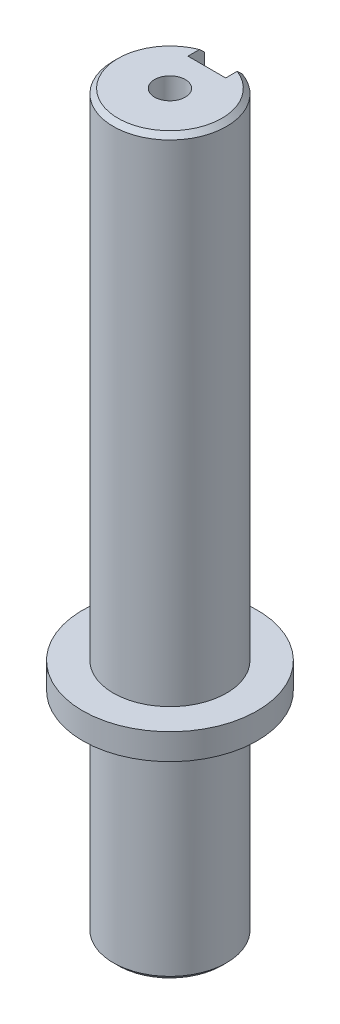
ISO-10303-21;
HEADER;
FILE_DESCRIPTION(('STEP AP214'),'2;1');
FILE_NAME('part.step','',(''),(''),'','','');
FILE_SCHEMA(('AUTOMOTIVE_DESIGN { 1 0 10303 214 1 1 1 1 }'));
ENDSEC;
DATA;
#1=APPLICATION_CONTEXT('core data for automotive mechanical design processes');
#2=APPLICATION_PROTOCOL_DEFINITION('international standard','automotive_design',2000,#1);
#3=PRODUCT_CONTEXT('',#1,'mechanical');
#4=PRODUCT('Part','Part','',(#3));
#5=PRODUCT_RELATED_PRODUCT_CATEGORY('part','',(#4));
#6=PRODUCT_DEFINITION_FORMATION('','',#4);
#7=PRODUCT_DEFINITION_CONTEXT('part definition',#1,'design');
#8=PRODUCT_DEFINITION('design','',#6,#7);
#9=PRODUCT_DEFINITION_SHAPE('','',#8);
#10=(LENGTH_UNIT() NAMED_UNIT(*) SI_UNIT(.MILLI.,.METRE.));
#11=(NAMED_UNIT(*) PLANE_ANGLE_UNIT() SI_UNIT($,.RADIAN.));
#12=(NAMED_UNIT(*) SI_UNIT($,.STERADIAN.) SOLID_ANGLE_UNIT());
#13=UNCERTAINTY_MEASURE_WITH_UNIT(LENGTH_MEASURE(1.E-05),#10,'distance_accuracy_value','');
#14=(GEOMETRIC_REPRESENTATION_CONTEXT(3) GLOBAL_UNCERTAINTY_ASSIGNED_CONTEXT((#13)) GLOBAL_UNIT_ASSIGNED_CONTEXT((#10,
#11,#12)) REPRESENTATION_CONTEXT('',''));
#15=CARTESIAN_POINT('',(0.,0.,0.));
#16=DIRECTION('',(0.,0.,1.));
#17=DIRECTION('',(1.,0.,0.));
#18=AXIS2_PLACEMENT_3D('',#15,#16,#17);
#19=CARTESIAN_POINT('',(0.,53.5,-7.81370849898466));
#20=DIRECTION('',(0.,0.,-1.));
#21=DIRECTION('',(-1.,0.,0.));
#22=AXIS2_PLACEMENT_3D('',#19,#20,#21);
#23=PLANE('',#22);
#24=DIRECTION('',(0.,1.,0.));
#25=VECTOR('',#24,1.);
#26=CARTESIAN_POINT('',(4.,53.5,-7.81370849898466));
#27=LINE('',#26,#25);
#28=CARTESIAN_POINT('',(4.,57.5,-7.81370849898466));
#29=VERTEX_POINT('',#28);
#30=CARTESIAN_POINT('',(4.,155.5,-7.81370849898466));
#31=VERTEX_POINT('',#30);
#32=EDGE_CURVE('E165',#29,#31,#27,.T.);
#33=ORIENTED_EDGE('',*,*,#32,.F.);
#34=CARTESIAN_POINT('',(0.,57.5,-7.81370849898466));
#35=DIRECTION('',(0.,0.,-1.));
#36=DIRECTION('',(-1.,0.,0.));
#37=AXIS2_PLACEMENT_3D('',#34,#35,#36);
#38=CIRCLE('',#37,4.);
#39=CARTESIAN_POINT('',(-3.99999999999989,57.5,-7.81370849898488));
#40=VERTEX_POINT('',#39);
#41=EDGE_CURVE('E267',#29,#40,#38,.T.);
#42=ORIENTED_EDGE('',*,*,#41,.T.);
#43=DIRECTION('',(0.,1.,0.));
#44=VECTOR('',#43,1.);
#45=CARTESIAN_POINT('',(-3.99999999999989,53.5,-7.81370849898488));
#46=LINE('',#45,#44);
#47=CARTESIAN_POINT('',(-3.99999999999989,155.5,-7.81370849898488));
#48=VERTEX_POINT('',#47);
#49=EDGE_CURVE('E161',#40,#48,#46,.T.);
#50=ORIENTED_EDGE('',*,*,#49,.T.);
#51=DIRECTION('',(-1.,0.,0.));
#52=VECTOR('',#51,1.);
#53=CARTESIAN_POINT('',(0.,155.5,-7.81370849898466));
#54=LINE('',#53,#52);
#55=EDGE_CURVE('E158',#31,#48,#54,.T.);
#56=ORIENTED_EDGE('',*,*,#55,.F.);
#57=EDGE_LOOP('',(#33,#42,#50,#56));
#58=FACE_BOUND('',#57,.T.);
#59=ADVANCED_FACE('F70',(#58),#23,.T.);
#60=CARTESIAN_POINT('',(-4.,53.5,0.));
#61=DIRECTION('',(1.,0.,0.));
#62=DIRECTION('',(0.,0.,-1.));
#63=AXIS2_PLACEMENT_3D('',#60,#61,#62);
#64=PLANE('',#63);
#65=DIRECTION('',(0.,1.,0.));
#66=VECTOR('',#65,1.);
#67=CARTESIAN_POINT('',(-3.99999999999989,53.5,-11.3137084989849));
#68=LINE('',#67,#66);
#69=CARTESIAN_POINT('',(-3.99999999999989,57.5,-11.3137084989849));
#70=VERTEX_POINT('',#69);
#71=CARTESIAN_POINT('',(-3.99999999999989,154.5,-11.3137084989849));
#72=VERTEX_POINT('',#71);
#73=EDGE_CURVE('E180',#70,#72,#68,.T.);
#74=ORIENTED_EDGE('',*,*,#73,.T.);
#75=CARTESIAN_POINT('',(-3.99999999999989,154.5,-11.3137084989849));
#76=CARTESIAN_POINT('',(-3.99999999999993,154.667198810851,-11.1364144185974));
#77=CARTESIAN_POINT('',(-3.99999999999997,154.83413154152,-10.9588709093336));
#78=CARTESIAN_POINT('',(-4.00000000000004,155.167464874957,-10.6032849984223));
#79=CARTESIAN_POINT('',(-4.00000000000008,155.333865477622,-10.4252425966776));
#80=CARTESIAN_POINT('',(-4.00000000000011,155.5,-10.2469507659595));
#81=B_SPLINE_CURVE_WITH_KNOTS('',3,(#75,#76,#77,#78,#79,#80),.UNSPECIFIED.,.F.,.F.,(4,2,4),(0.,
0.731091039647216,1.46218222169976),.UNSPECIFIED.);
#82=CARTESIAN_POINT('',(-4.00000000000011,155.5,-10.2469507659595));
#83=VERTEX_POINT('',#82);
#84=EDGE_CURVE('E12',#72,#83,#81,.T.);
#85=ORIENTED_EDGE('',*,*,#84,.T.);
#86=DIRECTION('',(0.,0.,-1.));
#87=VECTOR('',#86,1.);
#88=CARTESIAN_POINT('',(-4.,155.5,0.));
#89=LINE('',#88,#87);
#90=EDGE_CURVE('E174',#48,#83,#89,.T.);
#91=ORIENTED_EDGE('',*,*,#90,.F.);
#92=ORIENTED_EDGE('',*,*,#49,.F.);
#93=DIRECTION('',(0.,0.,1.));
#94=VECTOR('',#93,1.);
#95=CARTESIAN_POINT('',(-4.,57.5,-18.5010000000001));
#96=LINE('',#95,#94);
#97=EDGE_CURVE('E265',#70,#40,#96,.T.);
#98=ORIENTED_EDGE('',*,*,#97,.F.);
#99=EDGE_LOOP('',(#74,#85,#91,#92,#98));
#100=FACE_BOUND('',#99,.T.);
#101=ADVANCED_FACE('F254',(#100),#64,.T.);
#102=CARTESIAN_POINT('',(0.,155.5,0.));
#103=DIRECTION('',(0.,-1.,0.));
#104=DIRECTION('',(0.,0.,-1.));
#105=AXIS2_PLACEMENT_3D('',#102,#103,#104);
#106=CYLINDRICAL_SURFACE('',#105,12.);
#107=DIRECTION('',(0.,1.,0.));
#108=VECTOR('',#107,1.);
#109=CARTESIAN_POINT('',(4.,53.5,-11.3137084989847));
#110=LINE('',#109,#108);
#111=CARTESIAN_POINT('',(4.,57.5,-11.3137084989847));
#112=VERTEX_POINT('',#111);
#113=CARTESIAN_POINT('',(4.,154.5,-11.3137084989847));
#114=VERTEX_POINT('',#113);
#115=EDGE_CURVE('E170',#112,#114,#110,.T.);
#116=ORIENTED_EDGE('',*,*,#115,.T.);
#117=CARTESIAN_POINT('',(0.,154.5,0.));
#118=DIRECTION('',(0.,1.,0.));
#119=DIRECTION('',(0.,0.,1.));
#120=AXIS2_PLACEMENT_3D('',#117,#118,#119);
#121=CIRCLE('',#120,12.);
#122=EDGE_CURVE('E84',#114,#72,#121,.F.);
#123=ORIENTED_EDGE('',*,*,#122,.T.);
#124=ORIENTED_EDGE('',*,*,#73,.F.);
#125=CARTESIAN_POINT('',(-3.99999999999989,57.5,-11.3137084989849));
#126=CARTESIAN_POINT('',(-4.0000143864684,57.3908685761057,-11.3136910923281));
#127=CARTESIAN_POINT('',(-3.99553418773154,57.2817468816823,-11.3152871053599));
#128=CARTESIAN_POINT('',(-3.97769669154623,57.0643499429943,-11.3215764002224));
#129=CARTESIAN_POINT('',(-3.96434179039426,56.9560744782183,-11.3262688459697));
#130=CARTESIAN_POINT('',(-3.92891925441553,56.7414547303904,-11.3386033176684));
#131=CARTESIAN_POINT('',(-3.9068774775567,56.635105686862,-11.346236588253));
#132=CARTESIAN_POINT('',(-3.85430683779156,56.4247865778936,-11.3642019375156));
#133=CARTESIAN_POINT('',(-3.82377766832559,56.3208165985309,-11.3745341136756));
#134=CARTESIAN_POINT('',(-3.71986383636305,56.0136585142397,-11.409119386546));
#135=CARTESIAN_POINT('',(-3.63410027870671,55.8149076037054,-11.4369807115704));
#136=CARTESIAN_POINT('',(-3.43228108336758,55.4345918200631,-11.4991535391578));
#137=CARTESIAN_POINT('',(-3.31620771778421,55.2530370897961,-11.5334688132736));
#138=CARTESIAN_POINT('',(-3.0522200421986,54.905146857989,-11.6061756914587));
#139=CARTESIAN_POINT('',(-2.90332802086644,54.7395728903214,-11.6446683155076));
#140=CARTESIAN_POINT('',(-2.57998227121636,54.435196791905,-11.720547461166));
#141=CARTESIAN_POINT('',(-2.40551955419192,54.2964041153225,-11.757933588238));
#142=CARTESIAN_POINT('',(-2.0303320317529,54.0460246275899,-11.8285719563378));
#143=CARTESIAN_POINT('',(-1.82903402397803,53.935255778974,-11.8616884763775));
#144=CARTESIAN_POINT('',(-1.40949308782821,53.7495584806102,-11.9188065262515));
#145=CARTESIAN_POINT('',(-1.19127133912549,53.674586047707,-11.9428192344503));
#146=CARTESIAN_POINT('',(-0.810081080278689,53.5795049564322,-11.9736775420337));
#147=CARTESIAN_POINT('',(-0.649693220950102,53.5497521690928,-11.9834931523168));
#148=CARTESIAN_POINT('',(-0.326223679784831,53.5099968145067,-11.9966566846717));
#149=CARTESIAN_POINT('',(-0.163142147981938,53.499993150977,-12.0000049657477));
#150=CARTESIAN_POINT('',(0.2181055778936,53.5000091564941,-11.9999933612664));
#151=CARTESIAN_POINT('',(0.436319496016366,53.5179102560483,-11.9939934129074));
#152=CARTESIAN_POINT('',(0.86642603262292,53.5888740359435,-11.9706233020091));
#153=CARTESIAN_POINT('',(1.07831311459172,53.6419666208824,-11.9532434693613));
#154=CARTESIAN_POINT('',(1.48933871215006,53.7812818139502,-11.909010493377));
#155=CARTESIAN_POINT('',(1.68850164919173,53.86743858857,-11.8821761833222));
#156=CARTESIAN_POINT('',(2.06952254252613,54.0701783731822,-11.8217739977203));
#157=CARTESIAN_POINT('',(2.25137912568362,54.1867637947278,-11.7882055885263));
#158=CARTESIAN_POINT('',(2.59896117771403,54.4512990731305,-11.7165647864809));
#159=CARTESIAN_POINT('',(2.76400498372613,54.6001151904388,-11.6783844283082));
#160=CARTESIAN_POINT('',(3.06732294837923,54.9230595834902,-11.6024148410052));
#161=CARTESIAN_POINT('',(3.20558965516786,55.0971948818214,-11.5646257235156));
#162=CARTESIAN_POINT('',(3.45534400156485,55.4720033696002,-11.4925202195049));
#163=CARTESIAN_POINT('',(3.56593573359083,55.6733011406933,-11.4583368165484));
#164=CARTESIAN_POINT('',(3.75133069630495,56.0928757057306,-11.3989948692854));
#165=CARTESIAN_POINT('',(3.82617001380315,56.3111351194923,-11.3738272313359));
#166=CARTESIAN_POINT('',(3.92090394585882,56.69200489173,-11.3414361250663));
#167=CARTESIAN_POINT('',(3.95050199025232,56.8519855906294,-11.3311071522261));
#168=CARTESIAN_POINT('',(3.98016506273197,57.0939253033409,-11.3207061526229));
#169=CARTESIAN_POINT('',(3.98759710156899,57.1749193142616,-11.3180878796117));
#170=CARTESIAN_POINT('',(3.997516576769,57.3372697112402,-11.3145867201536));
#171=CARTESIAN_POINT('',(4.00000261472779,57.4186261932667,-11.3137043244997));
#172=CARTESIAN_POINT('',(4.,57.5,-11.3137084989847));
#173=B_SPLINE_CURVE_WITH_KNOTS('',3,(#125,#126,#127,#128,#129,#130,#131,#132,#133,#134,#135,
#136,#137,#138,#139,#140,#141,#142,#143,#144,#145,#146,#147,#148,#149,#150,#151,#152,#153,#154,
#155,#156,#157,#158,#159,#160,#161,#162,#163,#164,#165,#166,#167,#168,#169,#170,#171,#172),
.UNSPECIFIED.,.F.,.F.,(4,2,2,2,2,2,2,2,2,2,2,2,2,2,2,2,2,2,2,2,2,2,2,4),(0.,0.327274236963196,
0.654460141091434,0.980679388592138,1.30691042047213,1.95842568864501,2.61032287839656,
3.28518694756577,3.96028881898353,4.65327190315989,5.34540131183696,5.8343967832347,
6.32336510950358,6.97706938330256,7.63132986745462,8.28429436797284,8.93731063342861,
9.61073297369171,10.2843424535431,10.9775452861239,11.6700469461654,12.1577682109859,
12.4017439210315,12.6457886015868),.UNSPECIFIED.);
#174=EDGE_CURVE('E176',#70,#112,#173,.T.);
#175=ORIENTED_EDGE('',*,*,#174,.T.);
#176=EDGE_LOOP('',(#116,#123,#124,#175));
#177=FACE_BOUND('',#176,.T.);
#178=CARTESIAN_POINT('',(0.,50.5,0.));
#179=DIRECTION('',(0.,1.,0.));
#180=DIRECTION('',(0.,0.,1.));
#181=AXIS2_PLACEMENT_3D('',#178,#179,#180);
#182=CIRCLE('',#181,12.);
#183=CARTESIAN_POINT('',(0.,50.5,12.));
#184=VERTEX_POINT('',#183);
#185=EDGE_CURVE('E490',#184,#184,#182,.T.);
#186=ORIENTED_EDGE('',*,*,#185,.T.);
#187=EDGE_LOOP('',(#186));
#188=FACE_BOUND('',#187,.T.);
#189=ADVANCED_FACE('F249',(#177,#188),#106,.T.);
#190=CARTESIAN_POINT('',(0.,155.5,0.));
#191=DIRECTION('',(0.,1.,0.));
#192=DIRECTION('',(0.,0.,1.));
#193=AXIS2_PLACEMENT_3D('',#190,#191,#192);
#194=PLANE('',#193);
#195=CARTESIAN_POINT('',(0.,155.5,0.));
#196=DIRECTION('',(0.,1.,0.));
#197=DIRECTION('',(0.,0.,1.));
#198=AXIS2_PLACEMENT_3D('',#195,#196,#197);
#199=CIRCLE('',#198,3.25);
#200=CARTESIAN_POINT('',(0.,155.5,3.25));
#201=VERTEX_POINT('',#200);
#202=EDGE_CURVE('E526',#201,#201,#199,.T.);
#203=ORIENTED_EDGE('',*,*,#202,.F.);
#204=EDGE_LOOP('',(#203));
#205=FACE_BOUND('',#204,.T.);
#206=ORIENTED_EDGE('',*,*,#90,.T.);
#207=CARTESIAN_POINT('',(0.,155.5,0.));
#208=DIRECTION('',(0.,1.,0.));
#209=DIRECTION('',(0.,0.,1.));
#210=AXIS2_PLACEMENT_3D('',#207,#208,#209);
#211=CIRCLE('',#210,11.);
#212=CARTESIAN_POINT('',(4.00000000000011,155.5,-10.2469507659597));
#213=VERTEX_POINT('',#212);
#214=EDGE_CURVE('E160',#83,#213,#211,.T.);
#215=ORIENTED_EDGE('',*,*,#214,.T.);
#216=DIRECTION('',(0.,0.,1.));
#217=VECTOR('',#216,1.);
#218=CARTESIAN_POINT('',(4.,155.5,0.));
#219=LINE('',#218,#217);
#220=EDGE_CURVE('E153',#213,#31,#219,.T.);
#221=ORIENTED_EDGE('',*,*,#220,.T.);
#222=ORIENTED_EDGE('',*,*,#55,.T.);
#223=EDGE_LOOP('',(#206,#215,#221,#222));
#224=FACE_BOUND('',#223,.T.);
#225=ADVANCED_FACE('F156',(#205,#224),#194,.T.);
#226=CARTESIAN_POINT('',(-3.99999999999989,42.,-7.81370849898488));
#227=DIRECTION('',(0.,0.,1.));
#228=DIRECTION('',(1.,0.,0.));
#229=AXIS2_PLACEMENT_3D('',#226,#227,#228);
#230=PLANE('',#229);
#231=DIRECTION('',(0.,-1.,0.));
#232=VECTOR('',#231,1.);
#233=CARTESIAN_POINT('',(-3.99999999999989,42.,-7.81370849898488));
#234=LINE('',#233,#232);
#235=CARTESIAN_POINT('',(-3.99999999999989,38.,-7.81370849898488));
#236=VERTEX_POINT('',#235);
#237=CARTESIAN_POINT('',(-3.99999999999989,0.,-7.81370849898488));
#238=VERTEX_POINT('',#237);
#239=EDGE_CURVE('E499',#236,#238,#234,.T.);
#240=ORIENTED_EDGE('',*,*,#239,.F.);
#241=CARTESIAN_POINT('',(0.,38.,-7.81370849898466));
#242=DIRECTION('',(0.,0.,-1.));
#243=DIRECTION('',(-1.,0.,0.));
#244=AXIS2_PLACEMENT_3D('',#241,#242,#243);
#245=CIRCLE('',#244,4.);
#246=CARTESIAN_POINT('',(4.,38.,-7.81370849898466));
#247=VERTEX_POINT('',#246);
#248=EDGE_CURVE('E187',#236,#247,#245,.T.);
#249=ORIENTED_EDGE('',*,*,#248,.T.);
#250=DIRECTION('',(0.,-1.,0.));
#251=VECTOR('',#250,1.);
#252=CARTESIAN_POINT('',(4.,42.,-7.81370849898466));
#253=LINE('',#252,#251);
#254=CARTESIAN_POINT('',(4.,0.,-7.81370849898466));
#255=VERTEX_POINT('',#254);
#256=EDGE_CURVE('E500',#247,#255,#253,.T.);
#257=ORIENTED_EDGE('',*,*,#256,.T.);
#258=DIRECTION('',(-1.,0.,0.));
#259=VECTOR('',#258,1.);
#260=CARTESIAN_POINT('',(-3.99999999999989,0.,-7.81370849898488));
#261=LINE('',#260,#259);
#262=EDGE_CURVE('E196',#255,#238,#261,.T.);
#263=ORIENTED_EDGE('',*,*,#262,.T.);
#264=EDGE_LOOP('',(#240,#249,#257,#263));
#265=FACE_BOUND('',#264,.T.);
#266=ADVANCED_FACE('F237',(#265),#230,.F.);
#267=CARTESIAN_POINT('',(-3.99999999999989,42.,-12.));
#268=DIRECTION('',(-1.,0.,0.));
#269=DIRECTION('',(0.,0.,1.));
#270=AXIS2_PLACEMENT_3D('',#267,#268,#269);
#271=PLANE('',#270);
#272=DIRECTION('',(0.,0.,-1.));
#273=VECTOR('',#272,1.);
#274=CARTESIAN_POINT('',(-3.99999999999989,0.,-12.));
#275=LINE('',#274,#273);
#276=CARTESIAN_POINT('',(-4.00000000000011,0.,-10.2469507659595));
#277=VERTEX_POINT('',#276);
#278=EDGE_CURVE('E502',#238,#277,#275,.T.);
#279=ORIENTED_EDGE('',*,*,#278,.T.);
#280=CARTESIAN_POINT('',(-4.00000000000011,0.,-10.2469507659595));
#281=CARTESIAN_POINT('',(-4.,0.16613452237833,-10.4252425966776));
#282=CARTESIAN_POINT('',(-3.99999999999993,0.332535125042777,-10.6032849984223));
#283=CARTESIAN_POINT('',(-3.99999999999986,0.665868458479795,-10.9588709093336));
#284=CARTESIAN_POINT('',(-3.99999999999986,0.832801189148709,-11.1364144185974));
#285=CARTESIAN_POINT('',(-3.99999999999989,1.00000000000008,-11.3137084989849));
#286=B_SPLINE_CURVE_WITH_KNOTS('',3,(#280,#281,#282,#283,#284,#285),.UNSPECIFIED.,.F.,.F.,(4,2,
4),(0.,0.731091182052579,1.46218222169982),.UNSPECIFIED.);
#287=CARTESIAN_POINT('',(-3.99999999999989,1.00000000000008,-11.3137084989849));
#288=VERTEX_POINT('',#287);
#289=EDGE_CURVE('E226',#277,#288,#286,.T.);
#290=ORIENTED_EDGE('',*,*,#289,.T.);
#291=DIRECTION('',(0.,-1.,0.));
#292=VECTOR('',#291,1.);
#293=CARTESIAN_POINT('',(-3.99999999999989,45.,-11.3137084989849));
#294=LINE('',#293,#292);
#295=CARTESIAN_POINT('',(-3.99999999999989,38.,-11.3137084989849));
#296=VERTEX_POINT('',#295);
#297=EDGE_CURVE('E497',#296,#288,#294,.T.);
#298=ORIENTED_EDGE('',*,*,#297,.F.);
#299=DIRECTION('',(0.,0.,1.));
#300=VECTOR('',#299,1.);
#301=CARTESIAN_POINT('',(-4.,38.,-18.5010000000001));
#302=LINE('',#301,#300);
#303=EDGE_CURVE('E182',#296,#236,#302,.T.);
#304=ORIENTED_EDGE('',*,*,#303,.T.);
#305=ORIENTED_EDGE('',*,*,#239,.T.);
#306=EDGE_LOOP('',(#279,#290,#298,#304,#305));
#307=FACE_BOUND('',#306,.T.);
#308=ADVANCED_FACE('F207',(#307),#271,.F.);
#309=CARTESIAN_POINT('',(0.,45.,0.));
#310=DIRECTION('',(0.,-1.,0.));
#311=DIRECTION('',(0.,0.,-1.));
#312=AXIS2_PLACEMENT_3D('',#309,#310,#311);
#313=CYLINDRICAL_SURFACE('',#312,12.);
#314=ORIENTED_EDGE('',*,*,#297,.T.);
#315=CARTESIAN_POINT('',(0.,1.00000000000008,0.));
#316=DIRECTION('',(0.,1.,0.));
#317=DIRECTION('',(0.,0.,1.));
#318=AXIS2_PLACEMENT_3D('',#315,#316,#317);
#319=CIRCLE('',#318,12.);
#320=CARTESIAN_POINT('',(4.,1.00000000000008,-11.3137084989847));
#321=VERTEX_POINT('',#320);
#322=EDGE_CURVE('E475',#288,#321,#319,.T.);
#323=ORIENTED_EDGE('',*,*,#322,.T.);
#324=DIRECTION('',(0.,-1.,0.));
#325=VECTOR('',#324,1.);
#326=CARTESIAN_POINT('',(4.,45.,-11.3137084989847));
#327=LINE('',#326,#325);
#328=CARTESIAN_POINT('',(4.,38.,-11.3137084989847));
#329=VERTEX_POINT('',#328);
#330=EDGE_CURVE('E495',#321,#329,#327,.F.);
#331=ORIENTED_EDGE('',*,*,#330,.T.);
#332=CARTESIAN_POINT('',(4.,38.,-11.3137084989847));
#333=CARTESIAN_POINT('',(4.00001438646859,38.1091314238943,-11.313691092328));
#334=CARTESIAN_POINT('',(3.99553418773176,38.2182531183177,-11.3152871053598));
#335=CARTESIAN_POINT('',(3.97769669154644,38.4356500570057,-11.3215764002223));
#336=CARTESIAN_POINT('',(3.96434179039446,38.5439255217817,-11.3262688459696));
#337=CARTESIAN_POINT('',(3.92891925441576,38.7585452696097,-11.3386033176683));
#338=CARTESIAN_POINT('',(3.90687747755698,38.864894313138,-11.346236588253));
#339=CARTESIAN_POINT('',(3.8543068377917,39.0752134221064,-11.3642019375155));
#340=CARTESIAN_POINT('',(3.82377766832556,39.1791834014691,-11.3745341136754));
#341=CARTESIAN_POINT('',(3.7198638363628,39.4863414857602,-11.4091193865457));
#342=CARTESIAN_POINT('',(3.63410027870672,39.6850923962947,-11.4369807115701));
#343=CARTESIAN_POINT('',(3.4322810833679,40.0654081799371,-11.499153539158));
#344=CARTESIAN_POINT('',(3.31620771778456,40.2469629102039,-11.5334688132743));
#345=CARTESIAN_POINT('',(3.0522200421989,40.5948531420111,-11.6061756914594));
#346=CARTESIAN_POINT('',(2.90332802086665,40.7604271096787,-11.6446683155078));
#347=CARTESIAN_POINT('',(2.57998227121638,41.0648032080951,-11.7205474611657));
#348=CARTESIAN_POINT('',(2.40551955419184,41.2035958846775,-11.7579335882377));
#349=CARTESIAN_POINT('',(2.03033203175279,41.4539753724101,-11.8285719563376));
#350=CARTESIAN_POINT('',(1.829034023978,41.5647442210261,-11.8616884763775));
#351=CARTESIAN_POINT('',(1.40949308782822,41.7504415193899,-11.9188065262516));
#352=CARTESIAN_POINT('',(1.19127133912548,41.825413952293,-11.9428192344503));
#353=CARTESIAN_POINT('',(0.810081080278685,41.9204950435678,-11.9736775420337));
#354=CARTESIAN_POINT('',(0.649693220950107,41.9502478309073,-11.9834931523168));
#355=CARTESIAN_POINT('',(0.326223679784839,41.9900031854934,-11.9966566846717));
#356=CARTESIAN_POINT('',(0.16314214798194,42.000006849023,-12.0000049657477));
#357=CARTESIAN_POINT('',(-0.218105577893595,41.9999908435059,-11.9999933612664));
#358=CARTESIAN_POINT('',(-0.436319496016347,41.9820897439516,-11.9939934129074));
#359=CARTESIAN_POINT('',(-0.866426032622915,41.9111259640564,-11.9706233020092));
#360=CARTESIAN_POINT('',(-1.07831311459174,41.8580333791177,-11.9532434693613));
#361=CARTESIAN_POINT('',(-1.48933871215005,41.7187181860498,-11.909010493377));
#362=CARTESIAN_POINT('',(-1.68850164919167,41.6325614114298,-11.8821761833221));
#363=CARTESIAN_POINT('',(-2.06952254252619,41.4298216268176,-11.8217739977205));
#364=CARTESIAN_POINT('',(-2.25137912568385,41.3132362052722,-11.7882055885267));
#365=CARTESIAN_POINT('',(-2.59896117771421,41.0487009268696,-11.7165647864814));
#366=CARTESIAN_POINT('',(-2.76400498372608,40.8998848095611,-11.6783844283083));
#367=CARTESIAN_POINT('',(-3.0673229483791,40.5769404165097,-11.6024148410051));
#368=CARTESIAN_POINT('',(-3.20558965516787,40.4028051181785,-11.5646257235156));
#369=CARTESIAN_POINT('',(-3.45534400156484,40.0279966303999,-11.4925202195049));
#370=CARTESIAN_POINT('',(-3.56593573359065,39.8266988593067,-11.4583368165484));
#371=CARTESIAN_POINT('',(-3.75133069630472,39.4071242942693,-11.3989948692855));
#372=CARTESIAN_POINT('',(-3.82617001380305,39.1888648805077,-11.3738272313361));
#373=CARTESIAN_POINT('',(-3.9209039458587,38.8079951082701,-11.3414361250665));
#374=CARTESIAN_POINT('',(-3.95050199025212,38.6480144093707,-11.3311071522262));
#375=CARTESIAN_POINT('',(-3.98016506273173,38.4060746966591,-11.3207061526229));
#376=CARTESIAN_POINT('',(-3.98759710156874,38.3250806857385,-11.3180878796117));
#377=CARTESIAN_POINT('',(-3.99751657676879,38.1627302887599,-11.3145867201537));
#378=CARTESIAN_POINT('',(-4.00000261472761,38.0813738067333,-11.3137043244998));
#379=CARTESIAN_POINT('',(-3.99999999999989,38.,-11.3137084989849));
#380=B_SPLINE_CURVE_WITH_KNOTS('',3,(#332,#333,#334,#335,#336,#337,#338,#339,#340,#341,#342,
#343,#344,#345,#346,#347,#348,#349,#350,#351,#352,#353,#354,#355,#356,#357,#358,#359,#360,#361,
#362,#363,#364,#365,#366,#367,#368,#369,#370,#371,#372,#373,#374,#375,#376,#377,#378,#379),
.UNSPECIFIED.,.F.,.F.,(4,2,2,2,2,2,2,2,2,2,2,2,2,2,2,2,2,2,2,2,2,2,2,4),(0.,0.327274236963222,
0.654460141091432,0.98067938859215,1.30691042047221,1.95842568864509,2.6103228783966,
3.28518694756587,3.96028881898373,4.65327190316008,5.34540131183711,5.83439678323484,
6.32336510950373,6.9770693833027,7.63132986745476,8.28429436797303,8.93731063342885,
9.6107329736919,10.2843424535432,10.9775452861239,11.6700469461654,12.1577682109859,
12.4017439210315,12.6457886015868),.UNSPECIFIED.);
#381=EDGE_CURVE('E188',#329,#296,#380,.T.);
#382=ORIENTED_EDGE('',*,*,#381,.T.);
#383=EDGE_LOOP('',(#314,#323,#331,#382));
#384=FACE_BOUND('',#383,.T.);
#385=CARTESIAN_POINT('',(0.,45.,0.));
#386=DIRECTION('',(0.,1.,0.));
#387=DIRECTION('',(0.,0.,1.));
#388=AXIS2_PLACEMENT_3D('',#385,#386,#387);
#389=CIRCLE('',#388,12.);
#390=CARTESIAN_POINT('',(0.,45.,12.));
#391=VERTEX_POINT('',#390);
#392=EDGE_CURVE('E476',#391,#391,#389,.T.);
#393=ORIENTED_EDGE('',*,*,#392,.F.);
#394=EDGE_LOOP('',(#393));
#395=FACE_BOUND('',#394,.T.);
#396=ADVANCED_FACE('F202',(#384,#395),#313,.T.);
#397=CARTESIAN_POINT('',(0.,0.,0.));
#398=DIRECTION('',(0.,1.,0.));
#399=DIRECTION('',(0.,0.,1.));
#400=AXIS2_PLACEMENT_3D('',#397,#398,#399);
#401=PLANE('',#400);
#402=CARTESIAN_POINT('',(0.,0.,0.));
#403=DIRECTION('',(0.,-1.,0.));
#404=DIRECTION('',(0.,0.,-1.));
#405=AXIS2_PLACEMENT_3D('',#402,#403,#404);
#406=CIRCLE('',#405,3.25);
#407=CARTESIAN_POINT('',(0.,0.,-3.25));
#408=VERTEX_POINT('',#407);
#409=EDGE_CURVE('E465',#408,#408,#406,.T.);
#410=ORIENTED_EDGE('',*,*,#409,.F.);
#411=EDGE_LOOP('',(#410));
#412=FACE_BOUND('',#411,.T.);
#413=DIRECTION('',(0.,0.,-1.));
#414=VECTOR('',#413,1.);
#415=CARTESIAN_POINT('',(4.,0.,0.));
#416=LINE('',#415,#414);
#417=CARTESIAN_POINT('',(4.00000000000011,0.,-10.2469507659597));
#418=VERTEX_POINT('',#417);
#419=EDGE_CURVE('E469',#255,#418,#416,.T.);
#420=ORIENTED_EDGE('',*,*,#419,.T.);
#421=CARTESIAN_POINT('',(0.,0.,0.));
#422=DIRECTION('',(0.,1.,0.));
#423=DIRECTION('',(0.,0.,1.));
#424=AXIS2_PLACEMENT_3D('',#421,#422,#423);
#425=CIRCLE('',#424,10.9999999999999);
#426=EDGE_CURVE('E232',#418,#277,#425,.F.);
#427=ORIENTED_EDGE('',*,*,#426,.T.);
#428=ORIENTED_EDGE('',*,*,#278,.F.);
#429=ORIENTED_EDGE('',*,*,#262,.F.);
#430=EDGE_LOOP('',(#420,#427,#428,#429));
#431=FACE_BOUND('',#430,.T.);
#432=ADVANCED_FACE('F206',(#412,#431),#401,.F.);
#433=CARTESIAN_POINT('',(0.,50.5,0.));
#434=DIRECTION('',(0.,-1.,0.));
#435=DIRECTION('',(0.,0.,-1.));
#436=AXIS2_PLACEMENT_3D('',#433,#434,#435);
#437=CYLINDRICAL_SURFACE('',#436,18.5);
#438=CARTESIAN_POINT('',(0.,50.5,0.));
#439=DIRECTION('',(0.,1.,0.));
#440=DIRECTION('',(0.,0.,1.));
#441=AXIS2_PLACEMENT_3D('',#438,#439,#440);
#442=CIRCLE('',#441,18.5);
#443=CARTESIAN_POINT('',(0.,50.5,18.5));
#444=VERTEX_POINT('',#443);
#445=EDGE_CURVE('E486',#444,#444,#442,.T.);
#446=ORIENTED_EDGE('',*,*,#445,.F.);
#447=EDGE_LOOP('',(#446));
#448=FACE_BOUND('',#447,.T.);
#449=CARTESIAN_POINT('',(0.,45.,0.));
#450=DIRECTION('',(0.,1.,0.));
#451=DIRECTION('',(0.,0.,1.));
#452=AXIS2_PLACEMENT_3D('',#449,#450,#451);
#453=CIRCLE('',#452,18.5);
#454=CARTESIAN_POINT('',(0.,45.,18.5));
#455=VERTEX_POINT('',#454);
#456=EDGE_CURVE('E487',#455,#455,#453,.T.);
#457=ORIENTED_EDGE('',*,*,#456,.T.);
#458=EDGE_LOOP('',(#457));
#459=FACE_BOUND('',#458,.T.);
#460=ADVANCED_FACE('F358',(#448,#459),#437,.T.);
#461=CARTESIAN_POINT('',(0.,50.5,0.));
#462=DIRECTION('',(0.,1.,0.));
#463=DIRECTION('',(0.,0.,1.));
#464=AXIS2_PLACEMENT_3D('',#461,#462,#463);
#465=PLANE('',#464);
#466=ORIENTED_EDGE('',*,*,#185,.F.);
#467=EDGE_LOOP('',(#466));
#468=FACE_BOUND('',#467,.T.);
#469=ORIENTED_EDGE('',*,*,#445,.T.);
#470=EDGE_LOOP('',(#469));
#471=FACE_BOUND('',#470,.T.);
#472=ADVANCED_FACE('F255',(#468,#471),#465,.T.);
#473=CARTESIAN_POINT('',(0.,45.,0.));
#474=DIRECTION('',(0.,1.,0.));
#475=DIRECTION('',(0.,0.,1.));
#476=AXIS2_PLACEMENT_3D('',#473,#474,#475);
#477=PLANE('',#476);
#478=ORIENTED_EDGE('',*,*,#392,.T.);
#479=EDGE_LOOP('',(#478));
#480=FACE_BOUND('',#479,.T.);
#481=ORIENTED_EDGE('',*,*,#456,.F.);
#482=EDGE_LOOP('',(#481));
#483=FACE_BOUND('',#482,.T.);
#484=ADVANCED_FACE('F245',(#480,#483),#477,.F.);
#485=CARTESIAN_POINT('',(4.,42.,-7.81370849898466));
#486=DIRECTION('',(1.,0.,0.));
#487=DIRECTION('',(0.,0.,-1.));
#488=AXIS2_PLACEMENT_3D('',#485,#486,#487);
#489=PLANE('',#488);
#490=ORIENTED_EDGE('',*,*,#330,.F.);
#491=CARTESIAN_POINT('',(4.,1.00000000000008,-11.3137084989847));
#492=CARTESIAN_POINT('',(3.99999999999999,0.832801189148724,-11.1364144185972));
#493=CARTESIAN_POINT('',(3.99999999999999,0.665868458479817,-10.9588709093335));
#494=CARTESIAN_POINT('',(4.00000000000002,0.332535125042799,-10.6032849984223));
#495=CARTESIAN_POINT('',(4.00000000000006,0.166134522378344,-10.4252425966777));
#496=CARTESIAN_POINT('',(4.00000000000011,0.,-10.2469507659597));
#497=B_SPLINE_CURVE_WITH_KNOTS('',3,(#491,#492,#493,#494,#495,#496),.UNSPECIFIED.,.F.,.F.,(4,2,
4),(0.,0.731091039647082,1.4621822216995),.UNSPECIFIED.);
#498=EDGE_CURVE('E217',#321,#418,#497,.T.);
#499=ORIENTED_EDGE('',*,*,#498,.T.);
#500=ORIENTED_EDGE('',*,*,#419,.F.);
#501=ORIENTED_EDGE('',*,*,#256,.F.);
#502=DIRECTION('',(0.,0.,1.));
#503=VECTOR('',#502,1.);
#504=CARTESIAN_POINT('',(3.99999999999989,38.,-18.5010000000001));
#505=LINE('',#504,#503);
#506=EDGE_CURVE('E197',#329,#247,#505,.T.);
#507=ORIENTED_EDGE('',*,*,#506,.F.);
#508=EDGE_LOOP('',(#490,#499,#500,#501,#507));
#509=FACE_BOUND('',#508,.T.);
#510=ADVANCED_FACE('F241',(#509),#489,.F.);
#511=CARTESIAN_POINT('',(1.11022302462516E-13,38.,-18.5010000000001));
#512=DIRECTION('',(0.,0.,1.));
#513=DIRECTION('',(1.,0.,0.));
#514=AXIS2_PLACEMENT_3D('',#511,#512,#513);
#515=CYLINDRICAL_SURFACE('',#514,4.);
#516=ORIENTED_EDGE('',*,*,#381,.F.);
#517=ORIENTED_EDGE('',*,*,#506,.T.);
#518=ORIENTED_EDGE('',*,*,#248,.F.);
#519=ORIENTED_EDGE('',*,*,#303,.F.);
#520=EDGE_LOOP('',(#516,#517,#518,#519));
#521=FACE_BOUND('',#520,.T.);
#522=ADVANCED_FACE('F199',(#521),#515,.F.);
#523=CARTESIAN_POINT('',(4.,53.5,0.));
#524=DIRECTION('',(-1.,0.,0.));
#525=DIRECTION('',(0.,0.,1.));
#526=AXIS2_PLACEMENT_3D('',#523,#524,#525);
#527=PLANE('',#526);
#528=ORIENTED_EDGE('',*,*,#220,.F.);
#529=CARTESIAN_POINT('',(4.00000000000011,155.5,-10.2469507659597));
#530=CARTESIAN_POINT('',(4.00000000000006,155.333865477622,-10.4252425966777));
#531=CARTESIAN_POINT('',(4.00000000000002,155.167464874957,-10.6032849984224));
#532=CARTESIAN_POINT('',(3.99999999999999,154.83413154152,-10.9588709093335));
#533=CARTESIAN_POINT('',(3.99999999999999,154.667198810851,-11.1364144185972));
#534=CARTESIAN_POINT('',(4.,154.5,-11.3137084989847));
#535=B_SPLINE_CURVE_WITH_KNOTS('',3,(#529,#530,#531,#532,#533,#534),.UNSPECIFIED.,.F.,.F.,(4,2,
4),(0.,0.731091182052386,1.46218222169944),.UNSPECIFIED.);
#536=EDGE_CURVE('E98',#213,#114,#535,.T.);
#537=ORIENTED_EDGE('',*,*,#536,.T.);
#538=ORIENTED_EDGE('',*,*,#115,.F.);
#539=DIRECTION('',(0.,0.,1.));
#540=VECTOR('',#539,1.);
#541=CARTESIAN_POINT('',(3.99999999999989,57.5,-18.5010000000001));
#542=LINE('',#541,#540);
#543=EDGE_CURVE('E168',#112,#29,#542,.T.);
#544=ORIENTED_EDGE('',*,*,#543,.T.);
#545=ORIENTED_EDGE('',*,*,#32,.T.);
#546=EDGE_LOOP('',(#528,#537,#538,#544,#545));
#547=FACE_BOUND('',#546,.T.);
#548=ADVANCED_FACE('F166',(#547),#527,.T.);
#549=CARTESIAN_POINT('',(1.11022302462516E-13,57.5,-18.5010000000001));
#550=DIRECTION('',(0.,0.,1.));
#551=DIRECTION('',(1.,0.,0.));
#552=AXIS2_PLACEMENT_3D('',#549,#550,#551);
#553=CYLINDRICAL_SURFACE('',#552,4.);
#554=ORIENTED_EDGE('',*,*,#174,.F.);
#555=ORIENTED_EDGE('',*,*,#97,.T.);
#556=ORIENTED_EDGE('',*,*,#41,.F.);
#557=ORIENTED_EDGE('',*,*,#543,.F.);
#558=EDGE_LOOP('',(#554,#555,#556,#557));
#559=FACE_BOUND('',#558,.T.);
#560=ADVANCED_FACE('F268',(#559),#553,.F.);
#561=CARTESIAN_POINT('',(0.,30.,0.));
#562=DIRECTION('',(0.,-1.,0.));
#563=DIRECTION('',(0.,0.,-1.));
#564=AXIS2_PLACEMENT_3D('',#561,#562,#563);
#565=CYLINDRICAL_SURFACE('',#564,3.25);
#566=CARTESIAN_POINT('',(0.,30.,0.));
#567=DIRECTION('',(0.,-1.,0.));
#568=DIRECTION('',(0.,0.,-1.));
#569=AXIS2_PLACEMENT_3D('',#566,#567,#568);
#570=CIRCLE('',#569,3.25);
#571=CARTESIAN_POINT('',(0.,30.,-3.25));
#572=VERTEX_POINT('',#571);
#573=EDGE_CURVE('E521',#572,#572,#570,.T.);
#574=ORIENTED_EDGE('',*,*,#573,.F.);
#575=EDGE_LOOP('',(#574));
#576=FACE_BOUND('',#575,.T.);
#577=ORIENTED_EDGE('',*,*,#409,.T.);
#578=EDGE_LOOP('',(#577));
#579=FACE_BOUND('',#578,.T.);
#580=ADVANCED_FACE('F273',(#576,#579),#565,.F.);
#581=CARTESIAN_POINT('',(0.,30.,0.));
#582=DIRECTION('',(0.,-1.,0.));
#583=DIRECTION('',(0.,0.,-1.));
#584=AXIS2_PLACEMENT_3D('',#581,#582,#583);
#585=PLANE('',#584);
#586=ORIENTED_EDGE('',*,*,#573,.T.);
#587=EDGE_LOOP('',(#586));
#588=FACE_BOUND('',#587,.T.);
#589=ADVANCED_FACE('F314',(#588),#585,.T.);
#590=CARTESIAN_POINT('',(0.,125.5,0.));
#591=DIRECTION('',(0.,1.,0.));
#592=DIRECTION('',(0.,0.,1.));
#593=AXIS2_PLACEMENT_3D('',#590,#591,#592);
#594=CYLINDRICAL_SURFACE('',#593,3.25);
#595=CARTESIAN_POINT('',(0.,125.5,0.));
#596=DIRECTION('',(0.,1.,0.));
#597=DIRECTION('',(0.,0.,1.));
#598=AXIS2_PLACEMENT_3D('',#595,#596,#597);
#599=CIRCLE('',#598,3.25);
#600=CARTESIAN_POINT('',(0.,125.5,3.25));
#601=VERTEX_POINT('',#600);
#602=EDGE_CURVE('E522',#601,#601,#599,.T.);
#603=ORIENTED_EDGE('',*,*,#602,.F.);
#604=EDGE_LOOP('',(#603));
#605=FACE_BOUND('',#604,.T.);
#606=ORIENTED_EDGE('',*,*,#202,.T.);
#607=EDGE_LOOP('',(#606));
#608=FACE_BOUND('',#607,.T.);
#609=ADVANCED_FACE('F306',(#605,#608),#594,.F.);
#610=CARTESIAN_POINT('',(0.,125.5,0.));
#611=DIRECTION('',(0.,1.,0.));
#612=DIRECTION('',(0.,0.,1.));
#613=AXIS2_PLACEMENT_3D('',#610,#611,#612);
#614=PLANE('',#613);
#615=ORIENTED_EDGE('',*,*,#602,.T.);
#616=EDGE_LOOP('',(#615));
#617=FACE_BOUND('',#616,.T.);
#618=ADVANCED_FACE('F213',(#617),#614,.T.);
#619=CARTESIAN_POINT('',(0.,1.00000000000008,0.));
#620=DIRECTION('',(0.,1.,0.));
#621=DIRECTION('',(0.,0.,1.));
#622=AXIS2_PLACEMENT_3D('',#619,#620,#621);
#623=CONICAL_SURFACE('',#622,12.,0.785398163397448);
#624=ORIENTED_EDGE('',*,*,#289,.F.);
#625=ORIENTED_EDGE('',*,*,#426,.F.);
#626=ORIENTED_EDGE('',*,*,#498,.F.);
#627=ORIENTED_EDGE('',*,*,#322,.F.);
#628=EDGE_LOOP('',(#624,#625,#626,#627));
#629=FACE_BOUND('',#628,.T.);
#630=ADVANCED_FACE('F210',(#629),#623,.T.);
#631=CARTESIAN_POINT('',(0.,155.5,0.));
#632=DIRECTION('',(0.,-1.,0.));
#633=DIRECTION('',(0.,0.,-1.));
#634=AXIS2_PLACEMENT_3D('',#631,#632,#633);
#635=CONICAL_SURFACE('',#634,11.,0.785398163397444);
#636=ORIENTED_EDGE('',*,*,#84,.F.);
#637=ORIENTED_EDGE('',*,*,#122,.F.);
#638=ORIENTED_EDGE('',*,*,#536,.F.);
#639=ORIENTED_EDGE('',*,*,#214,.F.);
#640=EDGE_LOOP('',(#636,#637,#638,#639));
#641=FACE_BOUND('',#640,.T.);
#642=ADVANCED_FACE('F72',(#641),#635,.T.);
#643=CLOSED_SHELL('',(#59,#101,#189,#225,#266,#308,#396,#432,#460,#472,#484,#510,#522,#548,#560,
#580,#589,#609,#618,#630,#642));
#644=MANIFOLD_SOLID_BREP('B2',#643);
#645=ADVANCED_BREP_SHAPE_REPRESENTATION('',(#18,#644),#14);
#646=SHAPE_DEFINITION_REPRESENTATION(#9,#645);
ENDSEC;
END-ISO-10303-21;
